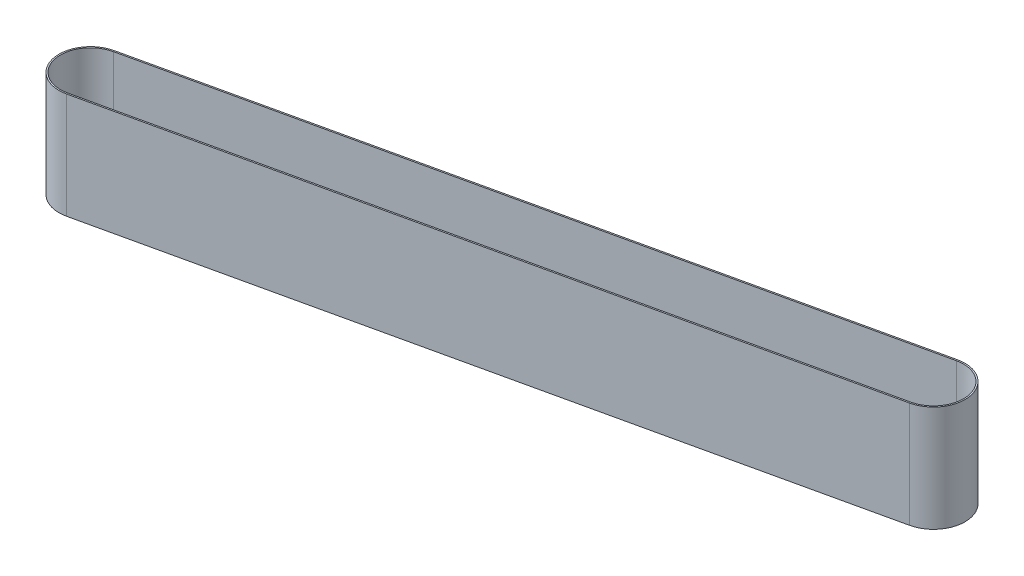
ISO-10303-21;
HEADER;
FILE_DESCRIPTION(('STEP AP214'),'2;1');
FILE_NAME('part.step','',(''),(''),'','','');
FILE_SCHEMA(('AUTOMOTIVE_DESIGN { 1 0 10303 214 1 1 1 1 }'));
ENDSEC;
DATA;
#1=APPLICATION_CONTEXT('core data for automotive mechanical design processes');
#2=APPLICATION_PROTOCOL_DEFINITION('international standard','automotive_design',2000,#1);
#3=PRODUCT_CONTEXT('',#1,'mechanical');
#4=PRODUCT('Part','Part','',(#3));
#5=PRODUCT_RELATED_PRODUCT_CATEGORY('part','',(#4));
#6=PRODUCT_DEFINITION_FORMATION('','',#4);
#7=PRODUCT_DEFINITION_CONTEXT('part definition',#1,'design');
#8=PRODUCT_DEFINITION('design','',#6,#7);
#9=PRODUCT_DEFINITION_SHAPE('','',#8);
#10=(LENGTH_UNIT() NAMED_UNIT(*) SI_UNIT(.MILLI.,.METRE.));
#11=(NAMED_UNIT(*) PLANE_ANGLE_UNIT() SI_UNIT($,.RADIAN.));
#12=(NAMED_UNIT(*) SI_UNIT($,.STERADIAN.) SOLID_ANGLE_UNIT());
#13=UNCERTAINTY_MEASURE_WITH_UNIT(LENGTH_MEASURE(1.E-05),#10,'distance_accuracy_value','');
#14=(GEOMETRIC_REPRESENTATION_CONTEXT(3) GLOBAL_UNCERTAINTY_ASSIGNED_CONTEXT((#13)) GLOBAL_UNIT_ASSIGNED_CONTEXT((#10,
#11,#12)) REPRESENTATION_CONTEXT('',''));
#15=CARTESIAN_POINT('',(0.,0.,0.));
#16=DIRECTION('',(0.,0.,1.));
#17=DIRECTION('',(1.,0.,0.));
#18=AXIS2_PLACEMENT_3D('',#15,#16,#17);
#19=CARTESIAN_POINT('',(-143.492057247952,150.,62.1779533160857));
#20=DIRECTION('',(0.,-1.,0.));
#21=DIRECTION('',(0.,0.,-1.));
#22=AXIS2_PLACEMENT_3D('',#19,#20,#21);
#23=PLANE('',#22);
#24=CARTESIAN_POINT('',(-143.492057247952,150.,62.1779533160857));
#25=DIRECTION('',(0.,1.,0.));
#26=DIRECTION('',(0.,0.,-1.));
#27=AXIS2_PLACEMENT_3D('',#24,#25,#26);
#28=CIRCLE('',#27,44.5789522285748);
#29=CARTESIAN_POINT('',(-153.20428398836,150.,18.669843341732));
#30=VERTEX_POINT('',#29);
#31=CARTESIAN_POINT('',(-133.779830507544,150.,105.686063290439));
#32=VERTEX_POINT('',#31);
#33=EDGE_CURVE('E136',#30,#32,#28,.T.);
#34=ORIENTED_EDGE('',*,*,#33,.T.);
#35=DIRECTION('',(0.975978747801644,0.,-0.217865747283817));
#36=VECTOR('',#35,1.);
#37=CARTESIAN_POINT('',(842.1989172941,150.,-112.179683993378));
#38=LINE('',#37,#36);
#39=CARTESIAN_POINT('',(842.1989172941,150.,-112.179683993378));
#40=VERTEX_POINT('',#39);
#41=EDGE_CURVE('E139',#32,#40,#38,.T.);
#42=ORIENTED_EDGE('',*,*,#41,.T.);
#43=CARTESIAN_POINT('',(832.486690553691,150.,-155.687793967732));
#44=DIRECTION('',(0.,1.,0.));
#45=DIRECTION('',(0.,0.,-1.));
#46=AXIS2_PLACEMENT_3D('',#43,#44,#45);
#47=CIRCLE('',#46,44.5789522285748);
#48=CARTESIAN_POINT('',(822.774463813283,150.,-199.195903942085));
#49=VERTEX_POINT('',#48);
#50=EDGE_CURVE('E142',#40,#49,#47,.T.);
#51=ORIENTED_EDGE('',*,*,#50,.T.);
#52=DIRECTION('',(-0.975978747801643,0.,0.217865747283817));
#53=VECTOR('',#52,1.);
#54=CARTESIAN_POINT('',(-153.20428398836,150.,18.669843341732));
#55=LINE('',#54,#53);
#56=EDGE_CURVE('E144',#49,#30,#55,.T.);
#57=ORIENTED_EDGE('',*,*,#56,.T.);
#58=EDGE_LOOP('',(#34,#42,#51,#57));
#59=FACE_BOUND('',#58,.T.);
#60=CARTESIAN_POINT('',(-143.492057247952,150.,62.1779533160857));
#61=DIRECTION('',(0.,1.,0.));
#62=DIRECTION('',(0.,0.,-1.));
#63=AXIS2_PLACEMENT_3D('',#60,#61,#62);
#64=CIRCLE('',#63,42.5789522285748);
#65=CARTESIAN_POINT('',(-152.768552493792,150.,20.6218008373353));
#66=VERTEX_POINT('',#65);
#67=CARTESIAN_POINT('',(-134.215562002112,150.,103.734105794836));
#68=VERTEX_POINT('',#67);
#69=EDGE_CURVE('E100',#66,#68,#64,.T.);
#70=ORIENTED_EDGE('',*,*,#69,.F.);
#71=DIRECTION('',(-0.975978747801643,0.,0.217865747283817));
#72=VECTOR('',#71,1.);
#73=CARTESIAN_POINT('',(-152.768552493792,150.,20.6218008373353));
#74=LINE('',#73,#72);
#75=CARTESIAN_POINT('',(823.210195307851,150.,-197.243946446482));
#76=VERTEX_POINT('',#75);
#77=EDGE_CURVE('E122',#76,#66,#74,.T.);
#78=ORIENTED_EDGE('',*,*,#77,.F.);
#79=CARTESIAN_POINT('',(832.486690553691,150.,-155.687793967732));
#80=DIRECTION('',(0.,1.,0.));
#81=DIRECTION('',(0.,0.,-1.));
#82=AXIS2_PLACEMENT_3D('',#79,#80,#81);
#83=CIRCLE('',#82,42.5789522285748);
#84=CARTESIAN_POINT('',(841.763185799532,150.,-114.131641488981));
#85=VERTEX_POINT('',#84);
#86=EDGE_CURVE('E120',#85,#76,#83,.T.);
#87=ORIENTED_EDGE('',*,*,#86,.F.);
#88=DIRECTION('',(0.975978747801644,0.,-0.217865747283818));
#89=VECTOR('',#88,1.);
#90=CARTESIAN_POINT('',(841.763185799532,150.,-114.131641488981));
#91=LINE('',#90,#89);
#92=EDGE_CURVE('E108',#68,#85,#91,.T.);
#93=ORIENTED_EDGE('',*,*,#92,.F.);
#94=EDGE_LOOP('',(#70,#78,#87,#93));
#95=FACE_BOUND('',#94,.T.);
#96=ADVANCED_FACE('F35',(#59,#95),#23,.F.);
#97=CARTESIAN_POINT('',(-143.492057247952,0.,62.1779533160857));
#98=DIRECTION('',(0.,-1.,0.));
#99=DIRECTION('',(0.,0.,-1.));
#100=AXIS2_PLACEMENT_3D('',#97,#98,#99);
#101=PLANE('',#100);
#102=CARTESIAN_POINT('',(-143.492057247952,0.,62.1779533160857));
#103=DIRECTION('',(0.,1.,0.));
#104=DIRECTION('',(0.,0.,-1.));
#105=AXIS2_PLACEMENT_3D('',#102,#103,#104);
#106=CIRCLE('',#105,44.5789522285748);
#107=CARTESIAN_POINT('',(-153.20428398836,0.,18.669843341732));
#108=VERTEX_POINT('',#107);
#109=CARTESIAN_POINT('',(-133.779830507544,0.,105.686063290439));
#110=VERTEX_POINT('',#109);
#111=EDGE_CURVE('E116',#108,#110,#106,.T.);
#112=ORIENTED_EDGE('',*,*,#111,.F.);
#113=DIRECTION('',(-0.975978747801643,0.,0.217865747283817));
#114=VECTOR('',#113,1.);
#115=CARTESIAN_POINT('',(-153.20428398836,0.,18.669843341732));
#116=LINE('',#115,#114);
#117=CARTESIAN_POINT('',(822.774463813283,0.,-199.195903942085));
#118=VERTEX_POINT('',#117);
#119=EDGE_CURVE('E140',#118,#108,#116,.T.);
#120=ORIENTED_EDGE('',*,*,#119,.F.);
#121=CARTESIAN_POINT('',(832.486690553691,0.,-155.687793967732));
#122=DIRECTION('',(0.,1.,0.));
#123=DIRECTION('',(0.,0.,-1.));
#124=AXIS2_PLACEMENT_3D('',#121,#122,#123);
#125=CIRCLE('',#124,44.5789522285748);
#126=CARTESIAN_POINT('',(842.1989172941,0.,-112.179683993378));
#127=VERTEX_POINT('',#126);
#128=EDGE_CURVE('E151',#127,#118,#125,.T.);
#129=ORIENTED_EDGE('',*,*,#128,.F.);
#130=DIRECTION('',(0.975978747801644,0.,-0.217865747283817));
#131=VECTOR('',#130,1.);
#132=CARTESIAN_POINT('',(842.1989172941,0.,-112.179683993378));
#133=LINE('',#132,#131);
#134=EDGE_CURVE('E149',#110,#127,#133,.T.);
#135=ORIENTED_EDGE('',*,*,#134,.F.);
#136=EDGE_LOOP('',(#112,#120,#129,#135));
#137=FACE_BOUND('',#136,.T.);
#138=DIRECTION('',(-0.975978747801643,0.,0.217865747283817));
#139=VECTOR('',#138,1.);
#140=CARTESIAN_POINT('',(-152.768552493792,0.,20.6218008373353));
#141=LINE('',#140,#139);
#142=CARTESIAN_POINT('',(823.210195307851,0.,-197.243946446482));
#143=VERTEX_POINT('',#142);
#144=CARTESIAN_POINT('',(-152.768552493792,0.,20.6218008373353));
#145=VERTEX_POINT('',#144);
#146=EDGE_CURVE('E109',#143,#145,#141,.T.);
#147=ORIENTED_EDGE('',*,*,#146,.T.);
#148=CARTESIAN_POINT('',(-143.492057247952,0.,62.1779533160857));
#149=DIRECTION('',(0.,1.,0.));
#150=DIRECTION('',(0.,0.,-1.));
#151=AXIS2_PLACEMENT_3D('',#148,#149,#150);
#152=CIRCLE('',#151,42.5789522285748);
#153=CARTESIAN_POINT('',(-134.215562002112,0.,103.734105794836));
#154=VERTEX_POINT('',#153);
#155=EDGE_CURVE('E58',#145,#154,#152,.T.);
#156=ORIENTED_EDGE('',*,*,#155,.T.);
#157=DIRECTION('',(0.975978747801644,0.,-0.217865747283818));
#158=VECTOR('',#157,1.);
#159=CARTESIAN_POINT('',(841.763185799532,0.,-114.131641488981));
#160=LINE('',#159,#158);
#161=CARTESIAN_POINT('',(841.763185799532,0.,-114.131641488981));
#162=VERTEX_POINT('',#161);
#163=EDGE_CURVE('E115',#154,#162,#160,.T.);
#164=ORIENTED_EDGE('',*,*,#163,.T.);
#165=CARTESIAN_POINT('',(832.486690553691,0.,-155.687793967732));
#166=DIRECTION('',(0.,1.,0.));
#167=DIRECTION('',(0.,0.,-1.));
#168=AXIS2_PLACEMENT_3D('',#165,#166,#167);
#169=CIRCLE('',#168,42.5789522285748);
#170=EDGE_CURVE('E128',#162,#143,#169,.T.);
#171=ORIENTED_EDGE('',*,*,#170,.T.);
#172=EDGE_LOOP('',(#147,#156,#164,#171));
#173=FACE_BOUND('',#172,.T.);
#174=ADVANCED_FACE('F169',(#137,#173),#101,.T.);
#175=CARTESIAN_POINT('',(-143.492057247952,150.,62.1779533160857));
#176=DIRECTION('',(0.,-1.,0.));
#177=DIRECTION('',(0.,0.,-1.));
#178=AXIS2_PLACEMENT_3D('',#175,#176,#177);
#179=CYLINDRICAL_SURFACE('',#178,44.5789522285748);
#180=ORIENTED_EDGE('',*,*,#111,.T.);
#181=DIRECTION('',(0.,-1.,0.));
#182=VECTOR('',#181,1.);
#183=CARTESIAN_POINT('',(-133.779830507544,150.,105.686063290439));
#184=LINE('',#183,#182);
#185=EDGE_CURVE('E11',#32,#110,#184,.T.);
#186=ORIENTED_EDGE('',*,*,#185,.F.);
#187=ORIENTED_EDGE('',*,*,#33,.F.);
#188=DIRECTION('',(0.,-1.,0.));
#189=VECTOR('',#188,1.);
#190=CARTESIAN_POINT('',(-153.20428398836,150.,18.669843341732));
#191=LINE('',#190,#189);
#192=EDGE_CURVE('E146',#30,#108,#191,.T.);
#193=ORIENTED_EDGE('',*,*,#192,.T.);
#194=EDGE_LOOP('',(#180,#186,#187,#193));
#195=FACE_BOUND('',#194,.T.);
#196=ADVANCED_FACE('F37',(#195),#179,.T.);
#197=CARTESIAN_POINT('',(842.1989172941,150.,-112.179683993378));
#198=DIRECTION('',(-0.217865747283817,0.,-0.975978747801643));
#199=DIRECTION('',(-0.975978747801643,0.,0.217865747283817));
#200=AXIS2_PLACEMENT_3D('',#197,#198,#199);
#201=PLANE('',#200);
#202=ORIENTED_EDGE('',*,*,#134,.T.);
#203=DIRECTION('',(0.,-1.,0.));
#204=VECTOR('',#203,1.);
#205=CARTESIAN_POINT('',(842.1989172941,150.,-112.179683993378));
#206=LINE('',#205,#204);
#207=EDGE_CURVE('E43',#40,#127,#206,.T.);
#208=ORIENTED_EDGE('',*,*,#207,.F.);
#209=ORIENTED_EDGE('',*,*,#41,.F.);
#210=ORIENTED_EDGE('',*,*,#185,.T.);
#211=EDGE_LOOP('',(#202,#208,#209,#210));
#212=FACE_BOUND('',#211,.T.);
#213=ADVANCED_FACE('F179',(#212),#201,.F.);
#214=CARTESIAN_POINT('',(832.486690553691,150.,-155.687793967732));
#215=DIRECTION('',(0.,-1.,0.));
#216=DIRECTION('',(0.,0.,-1.));
#217=AXIS2_PLACEMENT_3D('',#214,#215,#216);
#218=CYLINDRICAL_SURFACE('',#217,44.5789522285748);
#219=ORIENTED_EDGE('',*,*,#128,.T.);
#220=DIRECTION('',(0.,-1.,0.));
#221=VECTOR('',#220,1.);
#222=CARTESIAN_POINT('',(822.774463813283,150.,-199.195903942085));
#223=LINE('',#222,#221);
#224=EDGE_CURVE('E156',#49,#118,#223,.T.);
#225=ORIENTED_EDGE('',*,*,#224,.F.);
#226=ORIENTED_EDGE('',*,*,#50,.F.);
#227=ORIENTED_EDGE('',*,*,#207,.T.);
#228=EDGE_LOOP('',(#219,#225,#226,#227));
#229=FACE_BOUND('',#228,.T.);
#230=ADVANCED_FACE('F163',(#229),#218,.T.);
#231=CARTESIAN_POINT('',(-153.20428398836,150.,18.669843341732));
#232=DIRECTION('',(0.217865747283817,0.,0.975978747801643));
#233=DIRECTION('',(0.975978747801643,0.,-0.217865747283817));
#234=AXIS2_PLACEMENT_3D('',#231,#232,#233);
#235=PLANE('',#234);
#236=ORIENTED_EDGE('',*,*,#119,.T.);
#237=ORIENTED_EDGE('',*,*,#192,.F.);
#238=ORIENTED_EDGE('',*,*,#56,.F.);
#239=ORIENTED_EDGE('',*,*,#224,.T.);
#240=EDGE_LOOP('',(#236,#237,#238,#239));
#241=FACE_BOUND('',#240,.T.);
#242=ADVANCED_FACE('F173',(#241),#235,.F.);
#243=CARTESIAN_POINT('',(-143.492057247952,150.,62.1779533160857));
#244=DIRECTION('',(0.,-1.,0.));
#245=DIRECTION('',(0.,0.,-1.));
#246=AXIS2_PLACEMENT_3D('',#243,#244,#245);
#247=CYLINDRICAL_SURFACE('',#246,42.5789522285748);
#248=ORIENTED_EDGE('',*,*,#155,.F.);
#249=DIRECTION('',(0.,-1.,0.));
#250=VECTOR('',#249,1.);
#251=CARTESIAN_POINT('',(-152.768552493792,150.,20.6218008373353));
#252=LINE('',#251,#250);
#253=EDGE_CURVE('E104',#66,#145,#252,.T.);
#254=ORIENTED_EDGE('',*,*,#253,.F.);
#255=ORIENTED_EDGE('',*,*,#69,.T.);
#256=DIRECTION('',(0.,-1.,0.));
#257=VECTOR('',#256,1.);
#258=CARTESIAN_POINT('',(-134.215562002112,150.,103.734105794836));
#259=LINE('',#258,#257);
#260=EDGE_CURVE('E103',#68,#154,#259,.T.);
#261=ORIENTED_EDGE('',*,*,#260,.T.);
#262=EDGE_LOOP('',(#248,#254,#255,#261));
#263=FACE_BOUND('',#262,.T.);
#264=ADVANCED_FACE('F102',(#263),#247,.F.);
#265=CARTESIAN_POINT('',(841.763185799532,150.,-114.131641488981));
#266=DIRECTION('',(-0.217865747283818,0.,-0.975978747801643));
#267=DIRECTION('',(-0.975978747801643,0.,0.217865747283818));
#268=AXIS2_PLACEMENT_3D('',#265,#266,#267);
#269=PLANE('',#268);
#270=ORIENTED_EDGE('',*,*,#163,.F.);
#271=ORIENTED_EDGE('',*,*,#260,.F.);
#272=ORIENTED_EDGE('',*,*,#92,.T.);
#273=DIRECTION('',(0.,-1.,0.));
#274=VECTOR('',#273,1.);
#275=CARTESIAN_POINT('',(841.763185799532,150.,-114.131641488981));
#276=LINE('',#275,#274);
#277=EDGE_CURVE('E117',#85,#162,#276,.T.);
#278=ORIENTED_EDGE('',*,*,#277,.T.);
#279=EDGE_LOOP('',(#270,#271,#272,#278));
#280=FACE_BOUND('',#279,.T.);
#281=ADVANCED_FACE('F112',(#280),#269,.T.);
#282=CARTESIAN_POINT('',(832.486690553691,150.,-155.687793967732));
#283=DIRECTION('',(0.,-1.,0.));
#284=DIRECTION('',(0.,0.,-1.));
#285=AXIS2_PLACEMENT_3D('',#282,#283,#284);
#286=CYLINDRICAL_SURFACE('',#285,42.5789522285748);
#287=ORIENTED_EDGE('',*,*,#170,.F.);
#288=ORIENTED_EDGE('',*,*,#277,.F.);
#289=ORIENTED_EDGE('',*,*,#86,.T.);
#290=DIRECTION('',(0.,-1.,0.));
#291=VECTOR('',#290,1.);
#292=CARTESIAN_POINT('',(823.210195307851,150.,-197.243946446482));
#293=LINE('',#292,#291);
#294=EDGE_CURVE('E50',#76,#143,#293,.T.);
#295=ORIENTED_EDGE('',*,*,#294,.T.);
#296=EDGE_LOOP('',(#287,#288,#289,#295));
#297=FACE_BOUND('',#296,.T.);
#298=ADVANCED_FACE('F202',(#297),#286,.F.);
#299=CARTESIAN_POINT('',(-152.768552493792,150.,20.6218008373353));
#300=DIRECTION('',(0.217865747283817,0.,0.975978747801643));
#301=DIRECTION('',(0.975978747801643,0.,-0.217865747283817));
#302=AXIS2_PLACEMENT_3D('',#299,#300,#301);
#303=PLANE('',#302);
#304=ORIENTED_EDGE('',*,*,#146,.F.);
#305=ORIENTED_EDGE('',*,*,#294,.F.);
#306=ORIENTED_EDGE('',*,*,#77,.T.);
#307=ORIENTED_EDGE('',*,*,#253,.T.);
#308=EDGE_LOOP('',(#304,#305,#306,#307));
#309=FACE_BOUND('',#308,.T.);
#310=ADVANCED_FACE('F206',(#309),#303,.T.);
#311=CLOSED_SHELL('',(#96,#174,#196,#213,#230,#242,#264,#281,#298,#310));
#312=MANIFOLD_SOLID_BREP('B2',#311);
#313=ADVANCED_BREP_SHAPE_REPRESENTATION('',(#18,#312),#14);
#314=SHAPE_DEFINITION_REPRESENTATION(#9,#313);
ENDSEC;
END-ISO-10303-21;
